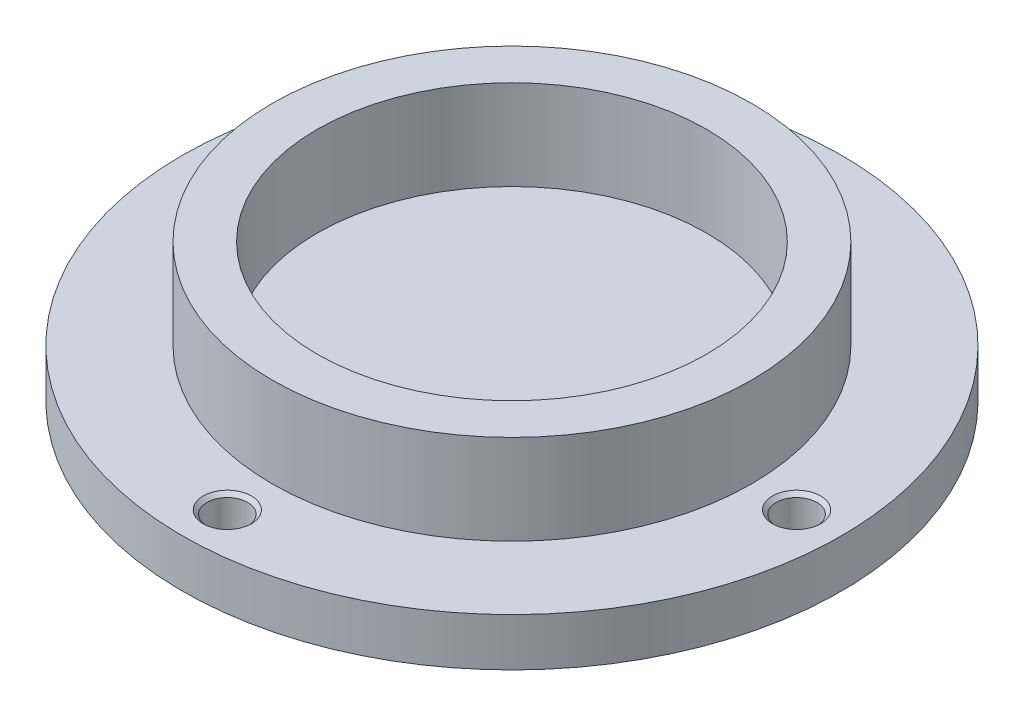
ISO-10303-21;
HEADER;
FILE_DESCRIPTION(('STEP AP214'),'2;1');
FILE_NAME('part.step','',(''),(''),'','','');
FILE_SCHEMA(('AUTOMOTIVE_DESIGN { 1 0 10303 214 1 1 1 1 }'));
ENDSEC;
DATA;
#1=APPLICATION_CONTEXT('core data for automotive mechanical design processes');
#2=APPLICATION_PROTOCOL_DEFINITION('international standard','automotive_design',2000,#1);
#3=PRODUCT_CONTEXT('',#1,'mechanical');
#4=PRODUCT('Part','Part','',(#3));
#5=PRODUCT_RELATED_PRODUCT_CATEGORY('part','',(#4));
#6=PRODUCT_DEFINITION_FORMATION('','',#4);
#7=PRODUCT_DEFINITION_CONTEXT('part definition',#1,'design');
#8=PRODUCT_DEFINITION('design','',#6,#7);
#9=PRODUCT_DEFINITION_SHAPE('','',#8);
#10=(LENGTH_UNIT() NAMED_UNIT(*) SI_UNIT(.MILLI.,.METRE.));
#11=(NAMED_UNIT(*) PLANE_ANGLE_UNIT() SI_UNIT($,.RADIAN.));
#12=(NAMED_UNIT(*) SI_UNIT($,.STERADIAN.) SOLID_ANGLE_UNIT());
#13=UNCERTAINTY_MEASURE_WITH_UNIT(LENGTH_MEASURE(1.E-05),#10,'distance_accuracy_value','');
#14=(GEOMETRIC_REPRESENTATION_CONTEXT(3) GLOBAL_UNCERTAINTY_ASSIGNED_CONTEXT((#13)) GLOBAL_UNIT_ASSIGNED_CONTEXT((#10,
#11,#12)) REPRESENTATION_CONTEXT('',''));
#15=CARTESIAN_POINT('',(0.,0.,0.));
#16=DIRECTION('',(0.,0.,1.));
#17=DIRECTION('',(1.,0.,0.));
#18=AXIS2_PLACEMENT_3D('',#15,#16,#17);
#19=CARTESIAN_POINT('',(55.,8.,0.));
#20=DIRECTION('',(0.,-1.,0.));
#21=DIRECTION('',(1.,0.,0.));
#22=AXIS2_PLACEMENT_3D('',#19,#20,#21);
#23=PLANE('',#22);
#24=CARTESIAN_POINT('',(47.5,8.,0.));
#25=DIRECTION('',(0.,1.,0.));
#26=DIRECTION('',(0.,0.,1.));
#27=AXIS2_PLACEMENT_3D('',#24,#25,#26);
#28=CIRCLE('',#27,4.025);
#29=CARTESIAN_POINT('',(47.5,8.,4.025));
#30=VERTEX_POINT('',#29);
#31=EDGE_CURVE('E91',#30,#30,#28,.T.);
#32=ORIENTED_EDGE('',*,*,#31,.F.);
#33=EDGE_LOOP('',(#32));
#34=FACE_BOUND('',#33,.T.);
#35=CARTESIAN_POINT('',(0.,7.99999999999998,47.5));
#36=DIRECTION('',(0.,1.,0.));
#37=DIRECTION('',(0.,0.,1.));
#38=AXIS2_PLACEMENT_3D('',#35,#36,#37);
#39=CIRCLE('',#38,4.025);
#40=CARTESIAN_POINT('',(0.,7.99999999999998,51.525));
#41=VERTEX_POINT('',#40);
#42=EDGE_CURVE('E81',#41,#41,#39,.T.);
#43=ORIENTED_EDGE('',*,*,#42,.F.);
#44=EDGE_LOOP('',(#43));
#45=FACE_BOUND('',#44,.T.);
#46=CARTESIAN_POINT('',(0.,7.99999999999998,0.));
#47=DIRECTION('',(0.,1.,0.));
#48=DIRECTION('',(-1.,0.,0.));
#49=AXIS2_PLACEMENT_3D('',#46,#47,#48);
#50=CIRCLE('',#49,40.);
#51=CARTESIAN_POINT('',(-40.,7.99999999999996,0.));
#52=VERTEX_POINT('',#51);
#53=EDGE_CURVE('E53',#52,#52,#50,.T.);
#54=ORIENTED_EDGE('',*,*,#53,.F.);
#55=EDGE_LOOP('',(#54));
#56=FACE_BOUND('',#55,.T.);
#57=CARTESIAN_POINT('',(0.,7.99999999999998,0.));
#58=DIRECTION('',(0.,1.,0.));
#59=DIRECTION('',(-1.,0.,0.));
#60=AXIS2_PLACEMENT_3D('',#57,#58,#59);
#61=CIRCLE('',#60,55.);
#62=CARTESIAN_POINT('',(-55.,7.99999999999995,0.));
#63=VERTEX_POINT('',#62);
#64=EDGE_CURVE('E49',#63,#63,#61,.T.);
#65=ORIENTED_EDGE('',*,*,#64,.T.);
#66=EDGE_LOOP('',(#65));
#67=FACE_BOUND('',#66,.T.);
#68=CARTESIAN_POINT('',(0.,7.99999999999998,-47.5));
#69=DIRECTION('',(0.,1.,0.));
#70=DIRECTION('',(0.,0.,1.));
#71=AXIS2_PLACEMENT_3D('',#68,#69,#70);
#72=CIRCLE('',#71,4.025);
#73=CARTESIAN_POINT('',(0.,7.99999999999998,-43.475));
#74=VERTEX_POINT('',#73);
#75=EDGE_CURVE('E74',#74,#74,#72,.T.);
#76=ORIENTED_EDGE('',*,*,#75,.F.);
#77=EDGE_LOOP('',(#76));
#78=FACE_BOUND('',#77,.T.);
#79=CARTESIAN_POINT('',(-47.5,7.99999999999996,0.));
#80=DIRECTION('',(0.,1.,0.));
#81=DIRECTION('',(0.,0.,1.));
#82=AXIS2_PLACEMENT_3D('',#79,#80,#81);
#83=CIRCLE('',#82,4.025);
#84=CARTESIAN_POINT('',(-47.5,7.99999999999996,4.02499999999999));
#85=VERTEX_POINT('',#84);
#86=EDGE_CURVE('E105',#85,#85,#83,.T.);
#87=ORIENTED_EDGE('',*,*,#86,.F.);
#88=EDGE_LOOP('',(#87));
#89=FACE_BOUND('',#88,.T.);
#90=ADVANCED_FACE('F43',(#34,#45,#56,#67,#78,#89),#23,.F.);
#91=CARTESIAN_POINT('',(0.,0.,0.));
#92=DIRECTION('',(0.,1.,0.));
#93=DIRECTION('',(-1.,0.,0.));
#94=AXIS2_PLACEMENT_3D('',#91,#92,#93);
#95=PLANE('',#94);
#96=CARTESIAN_POINT('',(-47.5,-1.16226472890446E-13,0.));
#97=DIRECTION('',(0.,1.,0.));
#98=DIRECTION('',(0.,0.,1.));
#99=AXIS2_PLACEMENT_3D('',#96,#97,#98);
#100=CIRCLE('',#99,3.4);
#101=CARTESIAN_POINT('',(-47.5,-1.16226472890446E-13,3.39999999999999));
#102=VERTEX_POINT('',#101);
#103=EDGE_CURVE('E98',#102,#102,#100,.T.);
#104=ORIENTED_EDGE('',*,*,#103,.T.);
#105=EDGE_LOOP('',(#104));
#106=FACE_BOUND('',#105,.T.);
#107=CARTESIAN_POINT('',(47.5,0.,0.));
#108=DIRECTION('',(0.,1.,0.));
#109=DIRECTION('',(0.,0.,1.));
#110=AXIS2_PLACEMENT_3D('',#107,#108,#109);
#111=CIRCLE('',#110,3.4);
#112=CARTESIAN_POINT('',(47.5,0.,3.4));
#113=VERTEX_POINT('',#112);
#114=EDGE_CURVE('E90',#113,#113,#111,.T.);
#115=ORIENTED_EDGE('',*,*,#114,.T.);
#116=EDGE_LOOP('',(#115));
#117=FACE_BOUND('',#116,.T.);
#118=CARTESIAN_POINT('',(0.,0.,47.5));
#119=DIRECTION('',(0.,1.,0.));
#120=DIRECTION('',(0.,0.,1.));
#121=AXIS2_PLACEMENT_3D('',#118,#119,#120);
#122=CIRCLE('',#121,3.4);
#123=CARTESIAN_POINT('',(0.,0.,50.9));
#124=VERTEX_POINT('',#123);
#125=EDGE_CURVE('E76',#124,#124,#122,.T.);
#126=ORIENTED_EDGE('',*,*,#125,.T.);
#127=EDGE_LOOP('',(#126));
#128=FACE_BOUND('',#127,.T.);
#129=CARTESIAN_POINT('',(0.,0.,-47.5));
#130=DIRECTION('',(0.,1.,0.));
#131=DIRECTION('',(0.,0.,1.));
#132=AXIS2_PLACEMENT_3D('',#129,#130,#131);
#133=CIRCLE('',#132,3.4);
#134=CARTESIAN_POINT('',(0.,0.,-44.1));
#135=VERTEX_POINT('',#134);
#136=EDGE_CURVE('E68',#135,#135,#133,.T.);
#137=ORIENTED_EDGE('',*,*,#136,.T.);
#138=EDGE_LOOP('',(#137));
#139=FACE_BOUND('',#138,.T.);
#140=CARTESIAN_POINT('',(0.,0.,0.));
#141=DIRECTION('',(0.,1.,0.));
#142=DIRECTION('',(-1.,0.,0.));
#143=AXIS2_PLACEMENT_3D('',#140,#141,#142);
#144=CIRCLE('',#143,55.);
#145=CARTESIAN_POINT('',(-55.,0.,0.));
#146=VERTEX_POINT('',#145);
#147=EDGE_CURVE('E10',#146,#146,#144,.T.);
#148=ORIENTED_EDGE('',*,*,#147,.F.);
#149=EDGE_LOOP('',(#148));
#150=FACE_BOUND('',#149,.T.);
#151=ADVANCED_FACE('F44',(#106,#117,#128,#139,#150),#95,.F.);
#152=CARTESIAN_POINT('',(0.,8.,0.));
#153=DIRECTION('',(0.,1.,0.));
#154=DIRECTION('',(-1.,0.,0.));
#155=AXIS2_PLACEMENT_3D('',#152,#153,#154);
#156=CYLINDRICAL_SURFACE('',#155,55.);
#157=ORIENTED_EDGE('',*,*,#64,.F.);
#158=EDGE_LOOP('',(#157));
#159=FACE_BOUND('',#158,.T.);
#160=ORIENTED_EDGE('',*,*,#147,.T.);
#161=EDGE_LOOP('',(#160));
#162=FACE_BOUND('',#161,.T.);
#163=ADVANCED_FACE('F114',(#159,#162),#156,.T.);
#164=CARTESIAN_POINT('',(0.,8.,0.));
#165=DIRECTION('',(0.,1.,0.));
#166=DIRECTION('',(-1.,0.,0.));
#167=AXIS2_PLACEMENT_3D('',#164,#165,#166);
#168=CYLINDRICAL_SURFACE('',#167,40.);
#169=CARTESIAN_POINT('',(0.,23.,0.));
#170=DIRECTION('',(0.,1.,0.));
#171=DIRECTION('',(-1.,0.,0.));
#172=AXIS2_PLACEMENT_3D('',#169,#170,#171);
#173=CIRCLE('',#172,40.);
#174=CARTESIAN_POINT('',(-40.,23.,0.));
#175=VERTEX_POINT('',#174);
#176=EDGE_CURVE('E59',#175,#175,#173,.T.);
#177=ORIENTED_EDGE('',*,*,#176,.F.);
#178=EDGE_LOOP('',(#177));
#179=FACE_BOUND('',#178,.T.);
#180=ORIENTED_EDGE('',*,*,#53,.T.);
#181=EDGE_LOOP('',(#180));
#182=FACE_BOUND('',#181,.T.);
#183=ADVANCED_FACE('F119',(#179,#182),#168,.T.);
#184=CARTESIAN_POINT('',(40.,23.,0.));
#185=DIRECTION('',(0.,-1.,0.));
#186=DIRECTION('',(1.,0.,0.));
#187=AXIS2_PLACEMENT_3D('',#184,#185,#186);
#188=PLANE('',#187);
#189=CARTESIAN_POINT('',(0.,23.,0.));
#190=DIRECTION('',(0.,1.,0.));
#191=DIRECTION('',(-1.,0.,0.));
#192=AXIS2_PLACEMENT_3D('',#189,#190,#191);
#193=CIRCLE('',#192,32.5);
#194=CARTESIAN_POINT('',(-32.5,23.,0.));
#195=VERTEX_POINT('',#194);
#196=EDGE_CURVE('E64',#195,#195,#193,.T.);
#197=ORIENTED_EDGE('',*,*,#196,.F.);
#198=EDGE_LOOP('',(#197));
#199=FACE_BOUND('',#198,.T.);
#200=ORIENTED_EDGE('',*,*,#176,.T.);
#201=EDGE_LOOP('',(#200));
#202=FACE_BOUND('',#201,.T.);
#203=ADVANCED_FACE('F130',(#199,#202),#188,.F.);
#204=CARTESIAN_POINT('',(0.,8.,0.));
#205=DIRECTION('',(0.,1.,0.));
#206=DIRECTION('',(-1.,0.,0.));
#207=AXIS2_PLACEMENT_3D('',#204,#205,#206);
#208=CYLINDRICAL_SURFACE('',#207,32.5);
#209=CARTESIAN_POINT('',(0.,7.99999999999998,0.));
#210=DIRECTION('',(0.,1.,0.));
#211=DIRECTION('',(-1.,0.,0.));
#212=AXIS2_PLACEMENT_3D('',#209,#210,#211);
#213=CIRCLE('',#212,32.5);
#214=CARTESIAN_POINT('',(-32.5,7.99999999999997,0.));
#215=VERTEX_POINT('',#214);
#216=EDGE_CURVE('E66',#215,#215,#213,.T.);
#217=ORIENTED_EDGE('',*,*,#216,.F.);
#218=EDGE_LOOP('',(#217));
#219=FACE_BOUND('',#218,.T.);
#220=ORIENTED_EDGE('',*,*,#196,.T.);
#221=EDGE_LOOP('',(#220));
#222=FACE_BOUND('',#221,.T.);
#223=ADVANCED_FACE('F135',(#219,#222),#208,.F.);
#224=CARTESIAN_POINT('',(32.5,8.,0.));
#225=DIRECTION('',(0.,-1.,0.));
#226=DIRECTION('',(1.,0.,0.));
#227=AXIS2_PLACEMENT_3D('',#224,#225,#226);
#228=PLANE('',#227);
#229=ORIENTED_EDGE('',*,*,#216,.T.);
#230=EDGE_LOOP('',(#229));
#231=FACE_BOUND('',#230,.T.);
#232=ADVANCED_FACE('F158',(#231),#228,.F.);
#233=CARTESIAN_POINT('',(0.,7.99999999999998,-47.5));
#234=DIRECTION('',(0.,1.,0.));
#235=DIRECTION('',(0.,0.,1.));
#236=AXIS2_PLACEMENT_3D('',#233,#234,#235);
#237=CYLINDRICAL_SURFACE('',#236,3.4);
#238=ORIENTED_EDGE('',*,*,#136,.F.);
#239=EDGE_LOOP('',(#238));
#240=FACE_BOUND('',#239,.T.);
#241=CARTESIAN_POINT('',(0.,7.37499999999997,-47.5));
#242=DIRECTION('',(0.,1.,0.));
#243=DIRECTION('',(0.,0.,1.));
#244=AXIS2_PLACEMENT_3D('',#241,#242,#243);
#245=CIRCLE('',#244,3.4);
#246=CARTESIAN_POINT('',(0.,7.37499999999997,-44.1));
#247=VERTEX_POINT('',#246);
#248=EDGE_CURVE('E75',#247,#247,#245,.T.);
#249=ORIENTED_EDGE('',*,*,#248,.T.);
#250=EDGE_LOOP('',(#249));
#251=FACE_BOUND('',#250,.T.);
#252=ADVANCED_FACE('F144',(#240,#251),#237,.F.);
#253=CARTESIAN_POINT('',(0.,7.99999999999998,-47.5));
#254=DIRECTION('',(0.,1.,0.));
#255=DIRECTION('',(0.,0.,1.));
#256=AXIS2_PLACEMENT_3D('',#253,#254,#255);
#257=CONICAL_SURFACE('',#256,4.025,0.785398163397447);
#258=ORIENTED_EDGE('',*,*,#248,.F.);
#259=EDGE_LOOP('',(#258));
#260=FACE_BOUND('',#259,.T.);
#261=ORIENTED_EDGE('',*,*,#75,.T.);
#262=EDGE_LOOP('',(#261));
#263=FACE_BOUND('',#262,.T.);
#264=ADVANCED_FACE('F142',(#260,#263),#257,.F.);
#265=CARTESIAN_POINT('',(0.,7.99999999999998,47.5));
#266=DIRECTION('',(0.,1.,0.));
#267=DIRECTION('',(0.,0.,1.));
#268=AXIS2_PLACEMENT_3D('',#265,#266,#267);
#269=CYLINDRICAL_SURFACE('',#268,3.4);
#270=ORIENTED_EDGE('',*,*,#125,.F.);
#271=EDGE_LOOP('',(#270));
#272=FACE_BOUND('',#271,.T.);
#273=CARTESIAN_POINT('',(0.,7.37499999999997,47.5));
#274=DIRECTION('',(0.,1.,0.));
#275=DIRECTION('',(0.,0.,1.));
#276=AXIS2_PLACEMENT_3D('',#273,#274,#275);
#277=CIRCLE('',#276,3.4);
#278=CARTESIAN_POINT('',(0.,7.37499999999997,50.9));
#279=VERTEX_POINT('',#278);
#280=EDGE_CURVE('E82',#279,#279,#277,.T.);
#281=ORIENTED_EDGE('',*,*,#280,.T.);
#282=EDGE_LOOP('',(#281));
#283=FACE_BOUND('',#282,.T.);
#284=ADVANCED_FACE('F141',(#272,#283),#269,.F.);
#285=CARTESIAN_POINT('',(0.,7.99999999999998,47.5));
#286=DIRECTION('',(0.,1.,0.));
#287=DIRECTION('',(0.,0.,1.));
#288=AXIS2_PLACEMENT_3D('',#285,#286,#287);
#289=CONICAL_SURFACE('',#288,4.025,0.785398163397447);
#290=ORIENTED_EDGE('',*,*,#280,.F.);
#291=EDGE_LOOP('',(#290));
#292=FACE_BOUND('',#291,.T.);
#293=ORIENTED_EDGE('',*,*,#42,.T.);
#294=EDGE_LOOP('',(#293));
#295=FACE_BOUND('',#294,.T.);
#296=ADVANCED_FACE('F155',(#292,#295),#289,.F.);
#297=CARTESIAN_POINT('',(47.5,8.,0.));
#298=DIRECTION('',(0.,1.,0.));
#299=DIRECTION('',(0.,0.,1.));
#300=AXIS2_PLACEMENT_3D('',#297,#298,#299);
#301=CYLINDRICAL_SURFACE('',#300,3.4);
#302=ORIENTED_EDGE('',*,*,#114,.F.);
#303=EDGE_LOOP('',(#302));
#304=FACE_BOUND('',#303,.T.);
#305=CARTESIAN_POINT('',(47.5,7.375,0.));
#306=DIRECTION('',(0.,1.,0.));
#307=DIRECTION('',(0.,0.,1.));
#308=AXIS2_PLACEMENT_3D('',#305,#306,#307);
#309=CIRCLE('',#308,3.4);
#310=CARTESIAN_POINT('',(47.5,7.375,3.4));
#311=VERTEX_POINT('',#310);
#312=EDGE_CURVE('E89',#311,#311,#309,.T.);
#313=ORIENTED_EDGE('',*,*,#312,.T.);
#314=EDGE_LOOP('',(#313));
#315=FACE_BOUND('',#314,.T.);
#316=ADVANCED_FACE('F209',(#304,#315),#301,.F.);
#317=CARTESIAN_POINT('',(47.5,8.,0.));
#318=DIRECTION('',(0.,1.,0.));
#319=DIRECTION('',(0.,0.,1.));
#320=AXIS2_PLACEMENT_3D('',#317,#318,#319);
#321=CONICAL_SURFACE('',#320,4.025,0.785398163397446);
#322=ORIENTED_EDGE('',*,*,#312,.F.);
#323=EDGE_LOOP('',(#322));
#324=FACE_BOUND('',#323,.T.);
#325=ORIENTED_EDGE('',*,*,#31,.T.);
#326=EDGE_LOOP('',(#325));
#327=FACE_BOUND('',#326,.T.);
#328=ADVANCED_FACE('F218',(#324,#327),#321,.F.);
#329=CARTESIAN_POINT('',(-47.5,7.99999999999995,0.));
#330=DIRECTION('',(0.,1.,0.));
#331=DIRECTION('',(0.,0.,1.));
#332=AXIS2_PLACEMENT_3D('',#329,#330,#331);
#333=CYLINDRICAL_SURFACE('',#332,3.4);
#334=ORIENTED_EDGE('',*,*,#103,.F.);
#335=EDGE_LOOP('',(#334));
#336=FACE_BOUND('',#335,.T.);
#337=CARTESIAN_POINT('',(-47.5,7.37499999999995,0.));
#338=DIRECTION('',(0.,1.,0.));
#339=DIRECTION('',(0.,0.,1.));
#340=AXIS2_PLACEMENT_3D('',#337,#338,#339);
#341=CIRCLE('',#340,3.4);
#342=CARTESIAN_POINT('',(-47.5,7.37499999999995,3.39999999999999));
#343=VERTEX_POINT('',#342);
#344=EDGE_CURVE('E100',#343,#343,#341,.T.);
#345=ORIENTED_EDGE('',*,*,#344,.T.);
#346=EDGE_LOOP('',(#345));
#347=FACE_BOUND('',#346,.T.);
#348=ADVANCED_FACE('F230',(#336,#347),#333,.F.);
#349=CARTESIAN_POINT('',(-47.5,7.99999999999996,0.));
#350=DIRECTION('',(0.,1.,0.));
#351=DIRECTION('',(0.,0.,1.));
#352=AXIS2_PLACEMENT_3D('',#349,#350,#351);
#353=CONICAL_SURFACE('',#352,4.025,0.785398163397446);
#354=ORIENTED_EDGE('',*,*,#344,.F.);
#355=EDGE_LOOP('',(#354));
#356=FACE_BOUND('',#355,.T.);
#357=ORIENTED_EDGE('',*,*,#86,.T.);
#358=EDGE_LOOP('',(#357));
#359=FACE_BOUND('',#358,.T.);
#360=ADVANCED_FACE('F106',(#356,#359),#353,.F.);
#361=CLOSED_SHELL('',(#90,#151,#163,#183,#203,#223,#232,#252,#264,#284,#296,#316,#328,#348,#360));
#362=MANIFOLD_SOLID_BREP('B2',#361);
#363=ADVANCED_BREP_SHAPE_REPRESENTATION('',(#18,#362),#14);
#364=SHAPE_DEFINITION_REPRESENTATION(#9,#363);
ENDSEC;
END-ISO-10303-21;
